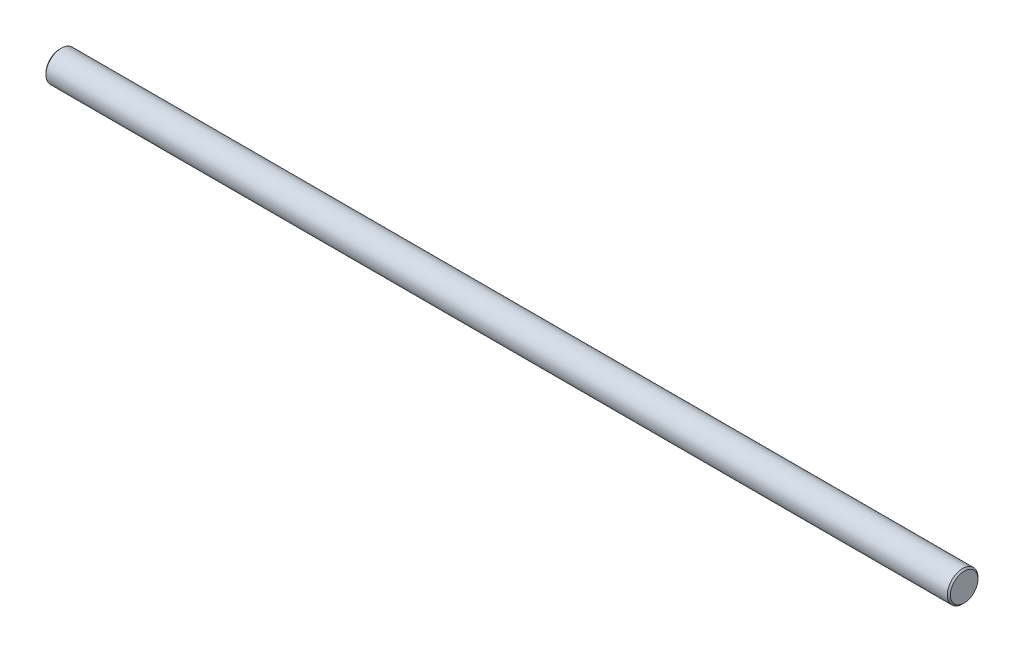
ISO-10303-21;
HEADER;
FILE_DESCRIPTION(('STEP AP214'),'2;1');
FILE_NAME('part.step','',(''),(''),'','','');
FILE_SCHEMA(('AUTOMOTIVE_DESIGN { 1 0 10303 214 1 1 1 1 }'));
ENDSEC;
DATA;
#1=APPLICATION_CONTEXT('core data for automotive mechanical design processes');
#2=APPLICATION_PROTOCOL_DEFINITION('international standard','automotive_design',2000,#1);
#3=PRODUCT_CONTEXT('',#1,'mechanical');
#4=PRODUCT('Part','Part','',(#3));
#5=PRODUCT_RELATED_PRODUCT_CATEGORY('part','',(#4));
#6=PRODUCT_DEFINITION_FORMATION('','',#4);
#7=PRODUCT_DEFINITION_CONTEXT('part definition',#1,'design');
#8=PRODUCT_DEFINITION('design','',#6,#7);
#9=PRODUCT_DEFINITION_SHAPE('','',#8);
#10=(LENGTH_UNIT() NAMED_UNIT(*) SI_UNIT(.MILLI.,.METRE.));
#11=(NAMED_UNIT(*) PLANE_ANGLE_UNIT() SI_UNIT($,.RADIAN.));
#12=(NAMED_UNIT(*) SI_UNIT($,.STERADIAN.) SOLID_ANGLE_UNIT());
#13=UNCERTAINTY_MEASURE_WITH_UNIT(LENGTH_MEASURE(1.E-05),#10,'distance_accuracy_value','');
#14=(GEOMETRIC_REPRESENTATION_CONTEXT(3) GLOBAL_UNCERTAINTY_ASSIGNED_CONTEXT((#13)) GLOBAL_UNIT_ASSIGNED_CONTEXT((#10,
#11,#12)) REPRESENTATION_CONTEXT('',''));
#15=CARTESIAN_POINT('',(0.,0.,0.));
#16=DIRECTION('',(0.,0.,1.));
#17=DIRECTION('',(1.,0.,0.));
#18=AXIS2_PLACEMENT_3D('',#15,#16,#17);
#19=CARTESIAN_POINT('',(-88.4,10.5734333010624,0.));
#20=DIRECTION('',(1.,0.,0.));
#21=DIRECTION('',(0.,0.,-1.));
#22=AXIS2_PLACEMENT_3D('',#19,#20,#21);
#23=CYLINDRICAL_SURFACE('',#22,3.00000000000001);
#24=CARTESIAN_POINT('',(-0.299999999999995,10.5734333010624,0.));
#25=DIRECTION('',(1.,0.,0.));
#26=DIRECTION('',(0.,0.,-1.));
#27=AXIS2_PLACEMENT_3D('',#24,#25,#26);
#28=CIRCLE('',#27,3.00000000000001);
#29=CARTESIAN_POINT('',(-0.299999999999995,10.5734333010624,-3.00000000000001));
#30=VERTEX_POINT('',#29);
#31=EDGE_CURVE('E10',#30,#30,#28,.F.);
#32=ORIENTED_EDGE('',*,*,#31,.T.);
#33=EDGE_LOOP('',(#32));
#34=FACE_BOUND('',#33,.T.);
#35=CARTESIAN_POINT('',(-176.5,10.5734333010624,0.));
#36=DIRECTION('',(1.,0.,0.));
#37=DIRECTION('',(0.,0.,-1.));
#38=AXIS2_PLACEMENT_3D('',#35,#36,#37);
#39=CIRCLE('',#38,3.00000000000001);
#40=CARTESIAN_POINT('',(-176.5,10.5734333010624,-3.00000000000001));
#41=VERTEX_POINT('',#40);
#42=EDGE_CURVE('E49',#41,#41,#39,.F.);
#43=ORIENTED_EDGE('',*,*,#42,.F.);
#44=EDGE_LOOP('',(#43));
#45=FACE_BOUND('',#44,.T.);
#46=ADVANCED_FACE('F37',(#34,#45),#23,.T.);
#47=CARTESIAN_POINT('',(0.,10.5734333010624,0.));
#48=DIRECTION('',(1.,0.,0.));
#49=DIRECTION('',(0.,0.,-1.));
#50=AXIS2_PLACEMENT_3D('',#47,#48,#49);
#51=PLANE('',#50);
#52=CARTESIAN_POINT('',(0.,10.5734333010624,0.));
#53=DIRECTION('',(1.,0.,0.));
#54=DIRECTION('',(0.,0.,-1.));
#55=AXIS2_PLACEMENT_3D('',#52,#53,#54);
#56=CIRCLE('',#55,2.70000000000001);
#57=CARTESIAN_POINT('',(0.,10.5734333010624,-2.70000000000001));
#58=VERTEX_POINT('',#57);
#59=EDGE_CURVE('E45',#58,#58,#56,.T.);
#60=ORIENTED_EDGE('',*,*,#59,.T.);
#61=EDGE_LOOP('',(#60));
#62=FACE_BOUND('',#61,.T.);
#63=ADVANCED_FACE('F70',(#62),#51,.T.);
#64=CARTESIAN_POINT('',(0.,10.5734333010624,0.));
#65=DIRECTION('',(-1.,0.,0.));
#66=DIRECTION('',(0.,0.,1.));
#67=AXIS2_PLACEMENT_3D('',#64,#65,#66);
#68=CONICAL_SURFACE('',#67,2.70000000000001,0.785398163397453);
#69=ORIENTED_EDGE('',*,*,#31,.F.);
#70=EDGE_LOOP('',(#69));
#71=FACE_BOUND('',#70,.T.);
#72=ORIENTED_EDGE('',*,*,#59,.F.);
#73=EDGE_LOOP('',(#72));
#74=FACE_BOUND('',#73,.T.);
#75=ADVANCED_FACE('F40',(#71,#74),#68,.T.);
#76=CARTESIAN_POINT('',(-176.8,10.5734333010624,0.));
#77=DIRECTION('',(-1.,0.,0.));
#78=DIRECTION('',(0.,0.,-1.));
#79=AXIS2_PLACEMENT_3D('',#76,#77,#78);
#80=PLANE('',#79);
#81=CARTESIAN_POINT('',(-176.8,10.5734333010624,0.));
#82=DIRECTION('',(1.,0.,0.));
#83=DIRECTION('',(0.,0.,-1.));
#84=AXIS2_PLACEMENT_3D('',#81,#82,#83);
#85=CIRCLE('',#84,2.70000000000001);
#86=CARTESIAN_POINT('',(-176.8,10.5734333010624,-2.70000000000001));
#87=VERTEX_POINT('',#86);
#88=EDGE_CURVE('E53',#87,#87,#85,.T.);
#89=ORIENTED_EDGE('',*,*,#88,.F.);
#90=EDGE_LOOP('',(#89));
#91=FACE_BOUND('',#90,.T.);
#92=ADVANCED_FACE('F61',(#91),#80,.T.);
#93=CARTESIAN_POINT('',(-176.8,10.5734333010624,0.));
#94=DIRECTION('',(1.,0.,0.));
#95=DIRECTION('',(0.,0.,1.));
#96=AXIS2_PLACEMENT_3D('',#93,#94,#95);
#97=CONICAL_SURFACE('',#96,2.70000000000001,0.785398163397453);
#98=ORIENTED_EDGE('',*,*,#42,.T.);
#99=EDGE_LOOP('',(#98));
#100=FACE_BOUND('',#99,.T.);
#101=ORIENTED_EDGE('',*,*,#88,.T.);
#102=EDGE_LOOP('',(#101));
#103=FACE_BOUND('',#102,.T.);
#104=ADVANCED_FACE('F59',(#100,#103),#97,.T.);
#105=CLOSED_SHELL('',(#46,#63,#75,#92,#104));
#106=MANIFOLD_SOLID_BREP('B2',#105);
#107=ADVANCED_BREP_SHAPE_REPRESENTATION('',(#18,#106),#14);
#108=SHAPE_DEFINITION_REPRESENTATION(#9,#107);
ENDSEC;
END-ISO-10303-21;
